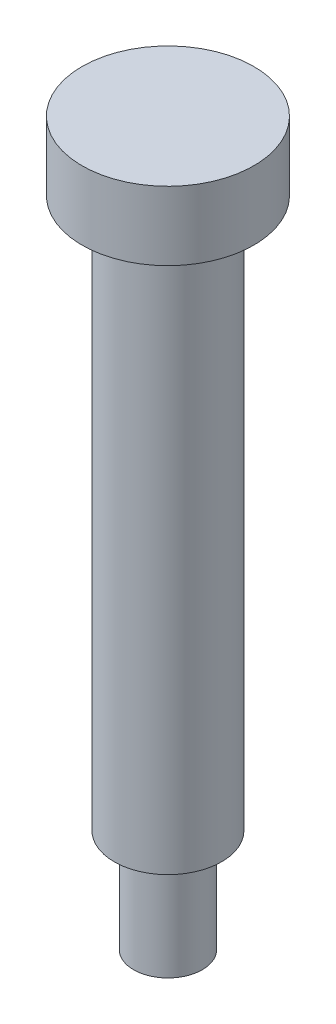
ISO-10303-21;
HEADER;
FILE_DESCRIPTION(('STEP AP214'),'2;1');
FILE_NAME('part.step','',(''),(''),'','','');
FILE_SCHEMA(('AUTOMOTIVE_DESIGN { 1 0 10303 214 1 1 1 1 }'));
ENDSEC;
DATA;
#1=APPLICATION_CONTEXT('core data for automotive mechanical design processes');
#2=APPLICATION_PROTOCOL_DEFINITION('international standard','automotive_design',2000,#1);
#3=PRODUCT_CONTEXT('',#1,'mechanical');
#4=PRODUCT('Part','Part','',(#3));
#5=PRODUCT_RELATED_PRODUCT_CATEGORY('part','',(#4));
#6=PRODUCT_DEFINITION_FORMATION('','',#4);
#7=PRODUCT_DEFINITION_CONTEXT('part definition',#1,'design');
#8=PRODUCT_DEFINITION('design','',#6,#7);
#9=PRODUCT_DEFINITION_SHAPE('','',#8);
#10=(LENGTH_UNIT() NAMED_UNIT(*) SI_UNIT(.MILLI.,.METRE.));
#11=(NAMED_UNIT(*) PLANE_ANGLE_UNIT() SI_UNIT($,.RADIAN.));
#12=(NAMED_UNIT(*) SI_UNIT($,.STERADIAN.) SOLID_ANGLE_UNIT());
#13=UNCERTAINTY_MEASURE_WITH_UNIT(LENGTH_MEASURE(1.E-05),#10,'distance_accuracy_value','');
#14=(GEOMETRIC_REPRESENTATION_CONTEXT(3) GLOBAL_UNCERTAINTY_ASSIGNED_CONTEXT((#13)) GLOBAL_UNIT_ASSIGNED_CONTEXT((#10,
#11,#12)) REPRESENTATION_CONTEXT('',''));
#15=CARTESIAN_POINT('',(0.,0.,0.));
#16=DIRECTION('',(0.,0.,1.));
#17=DIRECTION('',(1.,0.,0.));
#18=AXIS2_PLACEMENT_3D('',#15,#16,#17);
#19=CARTESIAN_POINT('',(0.,0.,0.));
#20=DIRECTION('',(0.,1.,0.));
#21=DIRECTION('',(-1.,0.,0.));
#22=AXIS2_PLACEMENT_3D('',#19,#20,#21);
#23=PLANE('',#22);
#24=CARTESIAN_POINT('',(0.,0.,0.));
#25=DIRECTION('',(0.,1.,0.));
#26=DIRECTION('',(-1.,0.,0.));
#27=AXIS2_PLACEMENT_3D('',#24,#25,#26);
#28=CIRCLE('',#27,2.);
#29=CARTESIAN_POINT('',(-2.,0.,0.));
#30=VERTEX_POINT('',#29);
#31=EDGE_CURVE('E10',#30,#30,#28,.T.);
#32=ORIENTED_EDGE('',*,*,#31,.F.);
#33=EDGE_LOOP('',(#32));
#34=FACE_BOUND('',#33,.T.);
#35=ADVANCED_FACE('F31',(#34),#23,.F.);
#36=CARTESIAN_POINT('',(0.,42.,0.));
#37=DIRECTION('',(0.,1.,0.));
#38=DIRECTION('',(-1.,0.,0.));
#39=AXIS2_PLACEMENT_3D('',#36,#37,#38);
#40=CYLINDRICAL_SURFACE('',#39,2.00000000000001);
#41=CARTESIAN_POINT('',(0.,6.00000000000001,0.));
#42=DIRECTION('',(0.,1.,0.));
#43=DIRECTION('',(-1.,0.,0.));
#44=AXIS2_PLACEMENT_3D('',#41,#42,#43);
#45=CIRCLE('',#44,2.00000000000001);
#46=CARTESIAN_POINT('',(-2.00000000000001,6.00000000000001,0.));
#47=VERTEX_POINT('',#46);
#48=EDGE_CURVE('E37',#47,#47,#45,.T.);
#49=ORIENTED_EDGE('',*,*,#48,.F.);
#50=EDGE_LOOP('',(#49));
#51=FACE_BOUND('',#50,.T.);
#52=ORIENTED_EDGE('',*,*,#31,.T.);
#53=EDGE_LOOP('',(#52));
#54=FACE_BOUND('',#53,.T.);
#55=ADVANCED_FACE('F79',(#51,#54),#40,.T.);
#56=CARTESIAN_POINT('',(2.00000000000001,6.00000000000001,0.));
#57=DIRECTION('',(0.,1.,0.));
#58=DIRECTION('',(-1.,0.,0.));
#59=AXIS2_PLACEMENT_3D('',#56,#57,#58);
#60=PLANE('',#59);
#61=CARTESIAN_POINT('',(0.,6.00000000000001,0.));
#62=DIRECTION('',(0.,1.,0.));
#63=DIRECTION('',(-1.,0.,0.));
#64=AXIS2_PLACEMENT_3D('',#61,#62,#63);
#65=CIRCLE('',#64,3.125);
#66=CARTESIAN_POINT('',(-3.125,6.00000000000001,0.));
#67=VERTEX_POINT('',#66);
#68=EDGE_CURVE('E41',#67,#67,#65,.T.);
#69=ORIENTED_EDGE('',*,*,#68,.F.);
#70=EDGE_LOOP('',(#69));
#71=FACE_BOUND('',#70,.T.);
#72=ORIENTED_EDGE('',*,*,#48,.T.);
#73=EDGE_LOOP('',(#72));
#74=FACE_BOUND('',#73,.T.);
#75=ADVANCED_FACE('F74',(#71,#74),#60,.F.);
#76=CARTESIAN_POINT('',(0.,42.,0.));
#77=DIRECTION('',(0.,1.,0.));
#78=DIRECTION('',(-1.,0.,0.));
#79=AXIS2_PLACEMENT_3D('',#76,#77,#78);
#80=CYLINDRICAL_SURFACE('',#79,3.125);
#81=CARTESIAN_POINT('',(0.,38.,0.));
#82=DIRECTION('',(0.,1.,0.));
#83=DIRECTION('',(-1.,0.,0.));
#84=AXIS2_PLACEMENT_3D('',#81,#82,#83);
#85=CIRCLE('',#84,3.125);
#86=CARTESIAN_POINT('',(-3.125,38.,0.));
#87=VERTEX_POINT('',#86);
#88=EDGE_CURVE('E45',#87,#87,#85,.T.);
#89=ORIENTED_EDGE('',*,*,#88,.F.);
#90=EDGE_LOOP('',(#89));
#91=FACE_BOUND('',#90,.T.);
#92=ORIENTED_EDGE('',*,*,#68,.T.);
#93=EDGE_LOOP('',(#92));
#94=FACE_BOUND('',#93,.T.);
#95=ADVANCED_FACE('F68',(#91,#94),#80,.T.);
#96=CARTESIAN_POINT('',(3.125,38.,0.));
#97=DIRECTION('',(0.,1.,0.));
#98=DIRECTION('',(-1.,0.,0.));
#99=AXIS2_PLACEMENT_3D('',#96,#97,#98);
#100=PLANE('',#99);
#101=CARTESIAN_POINT('',(0.,38.,0.));
#102=DIRECTION('',(0.,1.,0.));
#103=DIRECTION('',(-1.,0.,0.));
#104=AXIS2_PLACEMENT_3D('',#101,#102,#103);
#105=CIRCLE('',#104,5.);
#106=CARTESIAN_POINT('',(-5.,38.,0.));
#107=VERTEX_POINT('',#106);
#108=EDGE_CURVE('E50',#107,#107,#105,.T.);
#109=ORIENTED_EDGE('',*,*,#108,.F.);
#110=EDGE_LOOP('',(#109));
#111=FACE_BOUND('',#110,.T.);
#112=ORIENTED_EDGE('',*,*,#88,.T.);
#113=EDGE_LOOP('',(#112));
#114=FACE_BOUND('',#113,.T.);
#115=ADVANCED_FACE('F62',(#111,#114),#100,.F.);
#116=CARTESIAN_POINT('',(0.,42.,0.));
#117=DIRECTION('',(0.,1.,0.));
#118=DIRECTION('',(-1.,0.,0.));
#119=AXIS2_PLACEMENT_3D('',#116,#117,#118);
#120=CYLINDRICAL_SURFACE('',#119,5.);
#121=CARTESIAN_POINT('',(0.,42.,0.));
#122=DIRECTION('',(0.,1.,0.));
#123=DIRECTION('',(-1.,0.,0.));
#124=AXIS2_PLACEMENT_3D('',#121,#122,#123);
#125=CIRCLE('',#124,5.);
#126=CARTESIAN_POINT('',(-5.,42.,0.));
#127=VERTEX_POINT('',#126);
#128=EDGE_CURVE('E53',#127,#127,#125,.T.);
#129=ORIENTED_EDGE('',*,*,#128,.F.);
#130=EDGE_LOOP('',(#129));
#131=FACE_BOUND('',#130,.T.);
#132=ORIENTED_EDGE('',*,*,#108,.T.);
#133=EDGE_LOOP('',(#132));
#134=FACE_BOUND('',#133,.T.);
#135=ADVANCED_FACE('F59',(#131,#134),#120,.T.);
#136=CARTESIAN_POINT('',(5.,42.,0.));
#137=DIRECTION('',(0.,-1.,0.));
#138=DIRECTION('',(1.,0.,0.));
#139=AXIS2_PLACEMENT_3D('',#136,#137,#138);
#140=PLANE('',#139);
#141=ORIENTED_EDGE('',*,*,#128,.T.);
#142=EDGE_LOOP('',(#141));
#143=FACE_BOUND('',#142,.T.);
#144=ADVANCED_FACE('F57',(#143),#140,.F.);
#145=CLOSED_SHELL('',(#35,#55,#75,#95,#115,#135,#144));
#146=MANIFOLD_SOLID_BREP('B2',#145);
#147=ADVANCED_BREP_SHAPE_REPRESENTATION('',(#18,#146),#14);
#148=SHAPE_DEFINITION_REPRESENTATION(#9,#147);
ENDSEC;
END-ISO-10303-21;
